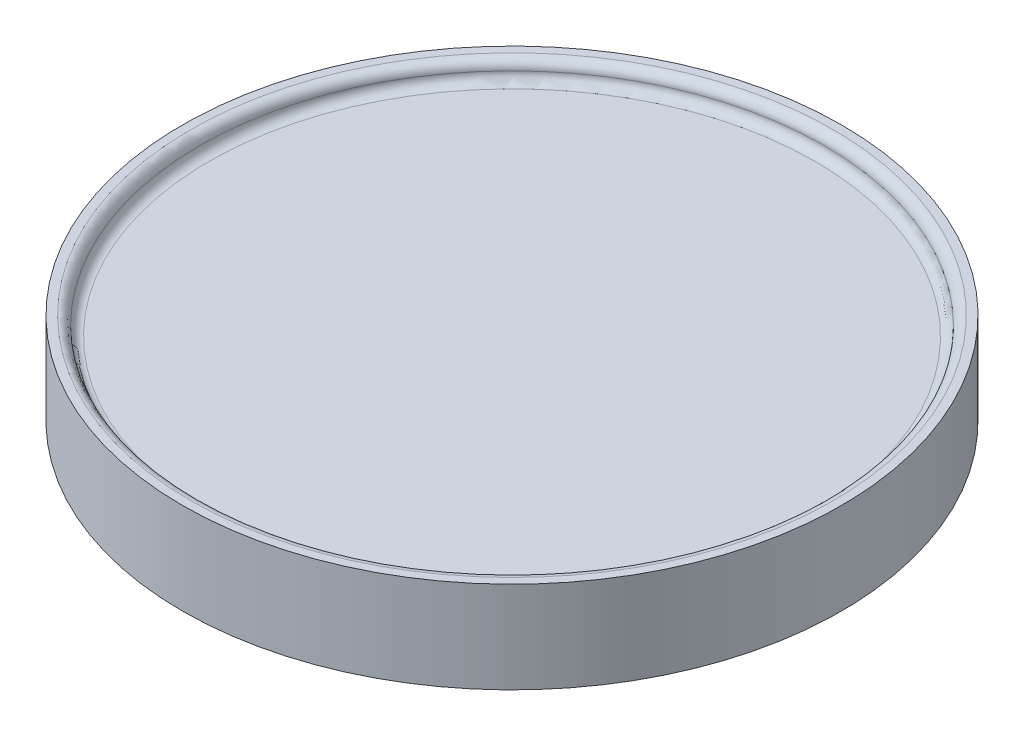
ISO-10303-21;
HEADER;
FILE_DESCRIPTION(('STEP AP214'),'2;1');
FILE_NAME('part.step','',(''),(''),'','','');
FILE_SCHEMA(('AUTOMOTIVE_DESIGN { 1 0 10303 214 1 1 1 1 }'));
ENDSEC;
DATA;
#1=APPLICATION_CONTEXT('core data for automotive mechanical design processes');
#2=APPLICATION_PROTOCOL_DEFINITION('international standard','automotive_design',2000,#1);
#3=PRODUCT_CONTEXT('',#1,'mechanical');
#4=PRODUCT('Part','Part','',(#3));
#5=PRODUCT_RELATED_PRODUCT_CATEGORY('part','',(#4));
#6=PRODUCT_DEFINITION_FORMATION('','',#4);
#7=PRODUCT_DEFINITION_CONTEXT('part definition',#1,'design');
#8=PRODUCT_DEFINITION('design','',#6,#7);
#9=PRODUCT_DEFINITION_SHAPE('','',#8);
#10=(LENGTH_UNIT() NAMED_UNIT(*) SI_UNIT(.MILLI.,.METRE.));
#11=(NAMED_UNIT(*) PLANE_ANGLE_UNIT() SI_UNIT($,.RADIAN.));
#12=(NAMED_UNIT(*) SI_UNIT($,.STERADIAN.) SOLID_ANGLE_UNIT());
#13=UNCERTAINTY_MEASURE_WITH_UNIT(LENGTH_MEASURE(1.E-05),#10,'distance_accuracy_value','');
#14=(GEOMETRIC_REPRESENTATION_CONTEXT(3) GLOBAL_UNCERTAINTY_ASSIGNED_CONTEXT((#13)) GLOBAL_UNIT_ASSIGNED_CONTEXT((#10,
#11,#12)) REPRESENTATION_CONTEXT('',''));
#15=CARTESIAN_POINT('',(0.,0.,0.));
#16=DIRECTION('',(0.,0.,1.));
#17=DIRECTION('',(1.,0.,0.));
#18=AXIS2_PLACEMENT_3D('',#15,#16,#17);
#19=CARTESIAN_POINT('',(0.,127.,0.));
#20=DIRECTION('',(0.,-1.,0.));
#21=DIRECTION('',(0.,0.,-1.));
#22=AXIS2_PLACEMENT_3D('',#19,#20,#21);
#23=CYLINDRICAL_SURFACE('',#22,457.2);
#24=CARTESIAN_POINT('',(0.,127.,0.));
#25=DIRECTION('',(0.,1.,0.));
#26=DIRECTION('',(0.,0.,1.));
#27=AXIS2_PLACEMENT_3D('',#24,#25,#26);
#28=CIRCLE('',#27,457.2);
#29=CARTESIAN_POINT('',(0.,127.,457.2));
#30=VERTEX_POINT('',#29);
#31=EDGE_CURVE('E49',#30,#30,#28,.T.);
#32=ORIENTED_EDGE('',*,*,#31,.F.);
#33=EDGE_LOOP('',(#32));
#34=FACE_BOUND('',#33,.T.);
#35=CARTESIAN_POINT('',(0.,0.,0.));
#36=DIRECTION('',(0.,1.,0.));
#37=DIRECTION('',(0.,0.,1.));
#38=AXIS2_PLACEMENT_3D('',#35,#36,#37);
#39=CIRCLE('',#38,457.2);
#40=CARTESIAN_POINT('',(0.,0.,457.2));
#41=VERTEX_POINT('',#40);
#42=EDGE_CURVE('E52',#41,#41,#39,.T.);
#43=ORIENTED_EDGE('',*,*,#42,.T.);
#44=EDGE_LOOP('',(#43));
#45=FACE_BOUND('',#44,.T.);
#46=ADVANCED_FACE('F34',(#34,#45),#23,.T.);
#47=CARTESIAN_POINT('',(0.,127.,0.));
#48=DIRECTION('',(0.,1.,0.));
#49=DIRECTION('',(0.,0.,1.));
#50=AXIS2_PLACEMENT_3D('',#47,#48,#49);
#51=PLANE('',#50);
#52=CARTESIAN_POINT('',(0.,127.,0.));
#53=DIRECTION('',(0.,1.,0.));
#54=DIRECTION('',(0.,0.,1.));
#55=AXIS2_PLACEMENT_3D('',#52,#53,#54);
#56=CIRCLE('',#55,445.736421311584);
#57=CARTESIAN_POINT('',(0.,127.,445.736421311584));
#58=VERTEX_POINT('',#57);
#59=EDGE_CURVE('E41',#58,#58,#56,.F.);
#60=ORIENTED_EDGE('',*,*,#59,.T.);
#61=EDGE_LOOP('',(#60));
#62=FACE_BOUND('',#61,.T.);
#63=ORIENTED_EDGE('',*,*,#31,.T.);
#64=EDGE_LOOP('',(#63));
#65=FACE_BOUND('',#64,.T.);
#66=ADVANCED_FACE('F58',(#62,#65),#51,.T.);
#67=CARTESIAN_POINT('',(0.,0.,0.));
#68=DIRECTION('',(0.,1.,0.));
#69=DIRECTION('',(0.,0.,1.));
#70=AXIS2_PLACEMENT_3D('',#67,#68,#69);
#71=PLANE('',#70);
#72=ORIENTED_EDGE('',*,*,#42,.F.);
#73=EDGE_LOOP('',(#72));
#74=FACE_BOUND('',#73,.T.);
#75=ADVANCED_FACE('F65',(#74),#71,.F.);
#76=CARTESIAN_POINT('',(0.,101.6,0.));
#77=DIRECTION('',(0.,1.,0.));
#78=DIRECTION('',(0.,0.,1.));
#79=AXIS2_PLACEMENT_3D('',#76,#77,#78);
#80=PLANE('',#79);
#81=CARTESIAN_POINT('',(0.,101.6,0.));
#82=DIRECTION('',(0.,1.,0.));
#83=DIRECTION('',(0.,0.,1.));
#84=AXIS2_PLACEMENT_3D('',#81,#82,#83);
#85=CIRCLE('',#84,420.336421311584);
#86=CARTESIAN_POINT('',(0.,101.6,420.336421311584));
#87=VERTEX_POINT('',#86);
#88=EDGE_CURVE('E10',#87,#87,#85,.T.);
#89=ORIENTED_EDGE('',*,*,#88,.T.);
#90=EDGE_LOOP('',(#89));
#91=FACE_BOUND('',#90,.T.);
#92=ADVANCED_FACE('F67',(#91),#80,.T.);
#93=CARTESIAN_POINT('',(0.,114.3,0.));
#94=DIRECTION('',(0.,1.,0.));
#95=DIRECTION('',(0.,0.,1.));
#96=AXIS2_PLACEMENT_3D('',#93,#94,#95);
#97=TOROIDAL_SURFACE('',#96,445.736421311584,12.7);
#98=ORIENTED_EDGE('',*,*,#59,.F.);
#99=EDGE_LOOP('',(#98));
#100=FACE_BOUND('',#99,.T.);
#101=CARTESIAN_POINT('',(0.,114.3,0.));
#102=DIRECTION('',(0.,1.,0.));
#103=DIRECTION('',(0.,0.,1.));
#104=AXIS2_PLACEMENT_3D('',#101,#102,#103);
#105=CIRCLE('',#104,433.036421311584);
#106=CARTESIAN_POINT('',(0.,114.3,433.036421311584));
#107=VERTEX_POINT('',#106);
#108=EDGE_CURVE('E45',#107,#107,#105,.T.);
#109=ORIENTED_EDGE('',*,*,#108,.F.);
#110=EDGE_LOOP('',(#109));
#111=FACE_BOUND('',#110,.T.);
#112=ADVANCED_FACE('F73',(#100,#111),#97,.T.);
#113=CARTESIAN_POINT('',(0.,114.3,0.));
#114=DIRECTION('',(0.,1.,0.));
#115=DIRECTION('',(0.,0.,1.));
#116=AXIS2_PLACEMENT_3D('',#113,#114,#115);
#117=TOROIDAL_SURFACE('',#116,420.336421311584,12.7);
#118=ORIENTED_EDGE('',*,*,#108,.T.);
#119=EDGE_LOOP('',(#118));
#120=FACE_BOUND('',#119,.T.);
#121=ORIENTED_EDGE('',*,*,#88,.F.);
#122=EDGE_LOOP('',(#121));
#123=FACE_BOUND('',#122,.T.);
#124=ADVANCED_FACE('F36',(#120,#123),#117,.F.);
#125=CLOSED_SHELL('',(#46,#66,#75,#92,#112,#124));
#126=MANIFOLD_SOLID_BREP('B2',#125);
#127=ADVANCED_BREP_SHAPE_REPRESENTATION('',(#18,#126),#14);
#128=SHAPE_DEFINITION_REPRESENTATION(#9,#127);
ENDSEC;
END-ISO-10303-21;
